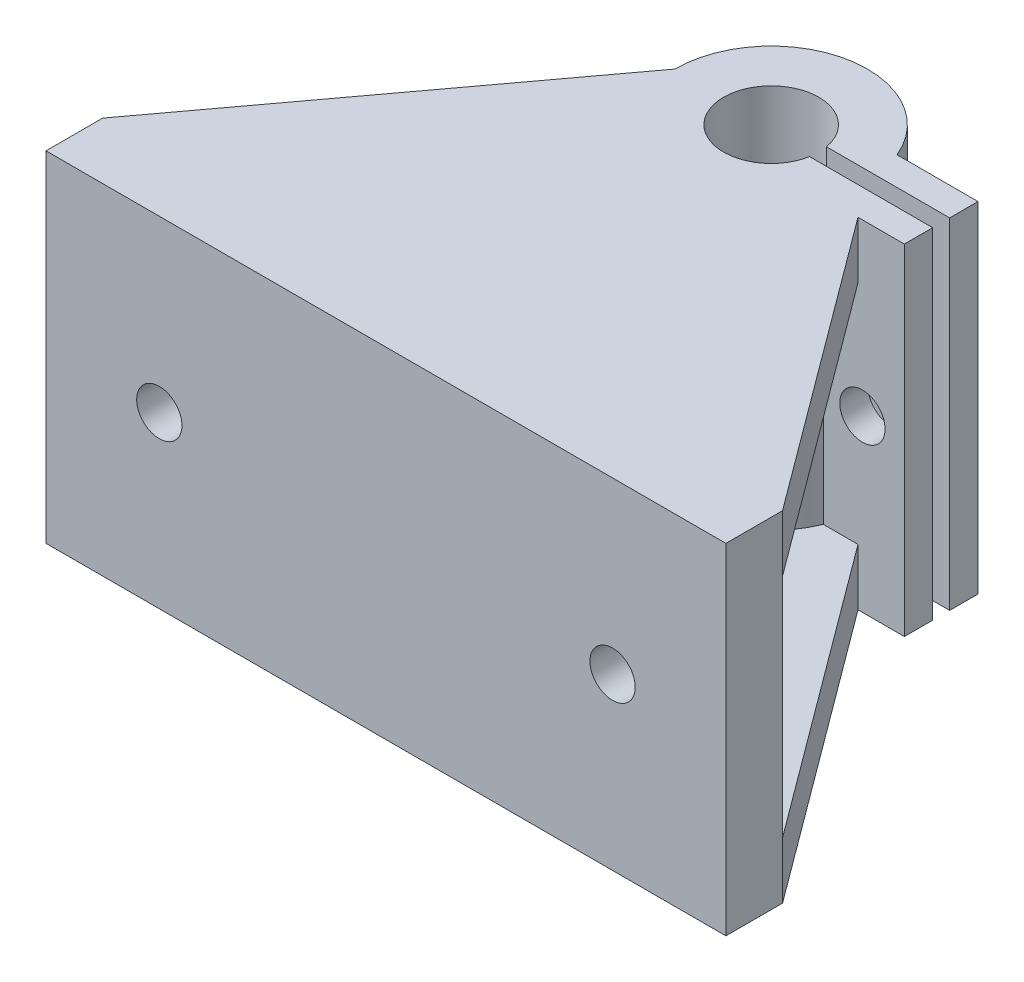
ISO-10303-21;
HEADER;
FILE_DESCRIPTION(('STEP AP214'),'2;1');
FILE_NAME('part.step','',(''),(''),'','','');
FILE_SCHEMA(('AUTOMOTIVE_DESIGN { 1 0 10303 214 1 1 1 1 }'));
ENDSEC;
DATA;
#1=APPLICATION_CONTEXT('core data for automotive mechanical design processes');
#2=APPLICATION_PROTOCOL_DEFINITION('international standard','automotive_design',2000,#1);
#3=PRODUCT_CONTEXT('',#1,'mechanical');
#4=PRODUCT('Part','Part','',(#3));
#5=PRODUCT_RELATED_PRODUCT_CATEGORY('part','',(#4));
#6=PRODUCT_DEFINITION_FORMATION('','',#4);
#7=PRODUCT_DEFINITION_CONTEXT('part definition',#1,'design');
#8=PRODUCT_DEFINITION('design','',#6,#7);
#9=PRODUCT_DEFINITION_SHAPE('','',#8);
#10=(LENGTH_UNIT() NAMED_UNIT(*) SI_UNIT(.MILLI.,.METRE.));
#11=(NAMED_UNIT(*) PLANE_ANGLE_UNIT() SI_UNIT($,.RADIAN.));
#12=(NAMED_UNIT(*) SI_UNIT($,.STERADIAN.) SOLID_ANGLE_UNIT());
#13=UNCERTAINTY_MEASURE_WITH_UNIT(LENGTH_MEASURE(1.E-05),#10,'distance_accuracy_value','');
#14=(GEOMETRIC_REPRESENTATION_CONTEXT(3) GLOBAL_UNCERTAINTY_ASSIGNED_CONTEXT((#13)) GLOBAL_UNIT_ASSIGNED_CONTEXT((#10,
#11,#12)) REPRESENTATION_CONTEXT('',''));
#15=CARTESIAN_POINT('',(0.,0.,0.));
#16=DIRECTION('',(0.,0.,1.));
#17=DIRECTION('',(1.,0.,0.));
#18=AXIS2_PLACEMENT_3D('',#15,#16,#17);
#19=CARTESIAN_POINT('',(0.,30.,-34.));
#20=DIRECTION('',(0.,-1.,0.));
#21=DIRECTION('',(0.,0.,-1.));
#22=AXIS2_PLACEMENT_3D('',#19,#20,#21);
#23=CYLINDRICAL_SURFACE('',#22,8.5);
#24=CARTESIAN_POINT('',(0.,30.,-34.));
#25=DIRECTION('',(0.,1.,0.));
#26=DIRECTION('',(0.,0.,1.));
#27=AXIS2_PLACEMENT_3D('',#24,#25,#26);
#28=CIRCLE('',#27,8.5);
#29=CARTESIAN_POINT('',(7.85413903620251,30.,-37.25));
#30=VERTEX_POINT('',#29);
#31=CARTESIAN_POINT('',(-8.5,30.,-33.9999999999999));
#32=VERTEX_POINT('',#31);
#33=EDGE_CURVE('E304',#30,#32,#28,.T.);
#34=ORIENTED_EDGE('',*,*,#33,.F.);
#35=DIRECTION('',(0.,-1.,0.));
#36=VECTOR('',#35,1.);
#37=CARTESIAN_POINT('',(7.85413903620251,30.,-37.25));
#38=LINE('',#37,#36);
#39=CARTESIAN_POINT('',(7.85413903620251,0.,-37.25));
#40=VERTEX_POINT('',#39);
#41=EDGE_CURVE('E214',#30,#40,#38,.T.);
#42=ORIENTED_EDGE('',*,*,#41,.T.);
#43=CARTESIAN_POINT('',(0.,0.,-34.));
#44=DIRECTION('',(0.,1.,0.));
#45=DIRECTION('',(0.,0.,1.));
#46=AXIS2_PLACEMENT_3D('',#43,#44,#45);
#47=CIRCLE('',#46,8.5);
#48=CARTESIAN_POINT('',(-8.5,0.,-34.));
#49=VERTEX_POINT('',#48);
#50=EDGE_CURVE('E302',#40,#49,#47,.T.);
#51=ORIENTED_EDGE('',*,*,#50,.T.);
#52=DIRECTION('',(0.,-1.,0.));
#53=VECTOR('',#52,1.);
#54=CARTESIAN_POINT('',(-8.5,5.,-34.));
#55=LINE('',#54,#53);
#56=CARTESIAN_POINT('',(-8.5,5.,-34.));
#57=VERTEX_POINT('',#56);
#58=EDGE_CURVE('E326',#57,#49,#55,.T.);
#59=ORIENTED_EDGE('',*,*,#58,.F.);
#60=CARTESIAN_POINT('',(0.,5.,-34.));
#61=DIRECTION('',(0.,1.,0.));
#62=DIRECTION('',(0.,0.,1.));
#63=AXIS2_PLACEMENT_3D('',#60,#61,#62);
#64=CIRCLE('',#63,8.5);
#65=CARTESIAN_POINT('',(-3.,5.,-26.0470131397066));
#66=VERTEX_POINT('',#65);
#67=EDGE_CURVE('E359',#66,#57,#64,.F.);
#68=ORIENTED_EDGE('',*,*,#67,.F.);
#69=DIRECTION('',(0.,-1.,0.));
#70=VECTOR('',#69,1.);
#71=CARTESIAN_POINT('',(-3.,30.,-26.0470131397066));
#72=LINE('',#71,#70);
#73=CARTESIAN_POINT('',(-3.,25.,-26.0470131397066));
#74=VERTEX_POINT('',#73);
#75=EDGE_CURVE('E365',#66,#74,#72,.F.);
#76=ORIENTED_EDGE('',*,*,#75,.T.);
#77=CARTESIAN_POINT('',(0.,25.,-34.));
#78=DIRECTION('',(0.,-1.,0.));
#79=DIRECTION('',(0.,0.,-1.));
#80=AXIS2_PLACEMENT_3D('',#77,#78,#79);
#81=CIRCLE('',#80,8.5);
#82=CARTESIAN_POINT('',(-8.5,25.,-33.9999999999999));
#83=VERTEX_POINT('',#82);
#84=EDGE_CURVE('E285',#74,#83,#81,.T.);
#85=ORIENTED_EDGE('',*,*,#84,.T.);
#86=DIRECTION('',(0.,1.,0.));
#87=VECTOR('',#86,1.);
#88=CARTESIAN_POINT('',(-8.5,25.,-33.9999999999999));
#89=LINE('',#88,#87);
#90=EDGE_CURVE('E275',#83,#32,#89,.T.);
#91=ORIENTED_EDGE('',*,*,#90,.T.);
#92=EDGE_LOOP('',(#34,#42,#51,#59,#68,#76,#85,#91));
#93=FACE_BOUND('',#92,.T.);
#94=ADVANCED_FACE('F36',(#93),#23,.T.);
#95=CARTESIAN_POINT('',(-30.,30.,-5.));
#96=DIRECTION('',(0.,0.,1.));
#97=DIRECTION('',(1.,0.,0.));
#98=AXIS2_PLACEMENT_3D('',#95,#96,#97);
#99=PLANE('',#98);
#100=CARTESIAN_POINT('',(-20.,15.,-5.));
#101=DIRECTION('',(0.,0.,1.));
#102=DIRECTION('',(1.,0.,0.));
#103=AXIS2_PLACEMENT_3D('',#100,#101,#102);
#104=CIRCLE('',#103,2.);
#105=CARTESIAN_POINT('',(-18.,15.,-5.));
#106=VERTEX_POINT('',#105);
#107=EDGE_CURVE('E255',#106,#106,#104,.F.);
#108=ORIENTED_EDGE('',*,*,#107,.F.);
#109=EDGE_LOOP('',(#108));
#110=FACE_BOUND('',#109,.T.);
#111=DIRECTION('',(0.,-1.,0.));
#112=VECTOR('',#111,1.);
#113=CARTESIAN_POINT('',(-30.,30.,-5.));
#114=LINE('',#113,#112);
#115=CARTESIAN_POINT('',(-30.,25.,-5.));
#116=VERTEX_POINT('',#115);
#117=CARTESIAN_POINT('',(-30.,5.,-5.));
#118=VERTEX_POINT('',#117);
#119=EDGE_CURVE('E340',#116,#118,#114,.T.);
#120=ORIENTED_EDGE('',*,*,#119,.F.);
#121=DIRECTION('',(1.,0.,0.));
#122=VECTOR('',#121,1.);
#123=CARTESIAN_POINT('',(30.,25.,-5.));
#124=LINE('',#123,#122);
#125=CARTESIAN_POINT('',(-3.,25.,-5.));
#126=VERTEX_POINT('',#125);
#127=EDGE_CURVE('E269',#116,#126,#124,.T.);
#128=ORIENTED_EDGE('',*,*,#127,.T.);
#129=DIRECTION('',(0.,1.,0.));
#130=VECTOR('',#129,1.);
#131=CARTESIAN_POINT('',(-3.,4.,-5.));
#132=LINE('',#131,#130);
#133=CARTESIAN_POINT('',(-3.,5.,-5.));
#134=VERTEX_POINT('',#133);
#135=EDGE_CURVE('E291',#134,#126,#132,.T.);
#136=ORIENTED_EDGE('',*,*,#135,.F.);
#137=DIRECTION('',(-1.,0.,0.));
#138=VECTOR('',#137,1.);
#139=CARTESIAN_POINT('',(-30.,5.,-5.));
#140=LINE('',#139,#138);
#141=EDGE_CURVE('E312',#134,#118,#140,.T.);
#142=ORIENTED_EDGE('',*,*,#141,.T.);
#143=EDGE_LOOP('',(#120,#128,#136,#142));
#144=FACE_BOUND('',#143,.T.);
#145=ADVANCED_FACE('F452',(#110,#144),#99,.F.);
#146=CARTESIAN_POINT('',(0.,5.,0.));
#147=DIRECTION('',(0.,1.,0.));
#148=DIRECTION('',(0.,0.,1.));
#149=AXIS2_PLACEMENT_3D('',#146,#147,#148);
#150=PLANE('',#149);
#151=DIRECTION('',(0.,0.,1.));
#152=VECTOR('',#151,1.);
#153=CARTESIAN_POINT('',(-3.,5.,0.));
#154=LINE('',#153,#152);
#155=EDGE_CURVE('E296',#66,#134,#154,.T.);
#156=ORIENTED_EDGE('',*,*,#155,.F.);
#157=ORIENTED_EDGE('',*,*,#67,.T.);
#158=DIRECTION('',(0.595558727232643,0.,-0.803311771616123));
#159=VECTOR('',#158,1.);
#160=CARTESIAN_POINT('',(-8.5,5.,-34.));
#161=LINE('',#160,#159);
#162=EDGE_CURVE('E311',#118,#57,#161,.T.);
#163=ORIENTED_EDGE('',*,*,#162,.F.);
#164=ORIENTED_EDGE('',*,*,#141,.F.);
#165=EDGE_LOOP('',(#156,#157,#163,#164));
#166=FACE_BOUND('',#165,.T.);
#167=ADVANCED_FACE('F457',(#166),#150,.T.);
#168=CARTESIAN_POINT('',(-30.,30.,0.));
#169=DIRECTION('',(1.,0.,0.));
#170=DIRECTION('',(0.,0.,-1.));
#171=AXIS2_PLACEMENT_3D('',#168,#169,#170);
#172=PLANE('',#171);
#173=DIRECTION('',(0.,0.,1.));
#174=VECTOR('',#173,1.);
#175=CARTESIAN_POINT('',(-30.,0.,0.));
#176=LINE('',#175,#174);
#177=CARTESIAN_POINT('',(-30.,0.,-5.));
#178=VERTEX_POINT('',#177);
#179=CARTESIAN_POINT('',(-30.,0.,0.));
#180=VERTEX_POINT('',#179);
#181=EDGE_CURVE('E325',#178,#180,#176,.T.);
#182=ORIENTED_EDGE('',*,*,#181,.T.);
#183=DIRECTION('',(0.,-1.,0.));
#184=VECTOR('',#183,1.);
#185=CARTESIAN_POINT('',(-30.,30.,0.));
#186=LINE('',#185,#184);
#187=CARTESIAN_POINT('',(-30.,30.,0.));
#188=VERTEX_POINT('',#187);
#189=EDGE_CURVE('E356',#188,#180,#186,.T.);
#190=ORIENTED_EDGE('',*,*,#189,.F.);
#191=DIRECTION('',(0.,0.,1.));
#192=VECTOR('',#191,1.);
#193=CARTESIAN_POINT('',(-30.,30.,0.));
#194=LINE('',#193,#192);
#195=CARTESIAN_POINT('',(-30.,30.,-5.));
#196=VERTEX_POINT('',#195);
#197=EDGE_CURVE('E331',#196,#188,#194,.T.);
#198=ORIENTED_EDGE('',*,*,#197,.F.);
#199=EDGE_CURVE('E347',#196,#116,#114,.T.);
#200=ORIENTED_EDGE('',*,*,#199,.T.);
#201=ORIENTED_EDGE('',*,*,#119,.T.);
#202=DIRECTION('',(0.,-1.,0.));
#203=VECTOR('',#202,1.);
#204=CARTESIAN_POINT('',(-30.,5.,-5.));
#205=LINE('',#204,#203);
#206=EDGE_CURVE('E317',#118,#178,#205,.T.);
#207=ORIENTED_EDGE('',*,*,#206,.T.);
#208=EDGE_LOOP('',(#182,#190,#198,#200,#201,#207));
#209=FACE_BOUND('',#208,.T.);
#210=ADVANCED_FACE('F38',(#209),#172,.F.);
#211=CARTESIAN_POINT('',(-30.,30.,0.));
#212=DIRECTION('',(0.,0.,-1.));
#213=DIRECTION('',(-1.,0.,0.));
#214=AXIS2_PLACEMENT_3D('',#211,#212,#213);
#215=PLANE('',#214);
#216=CARTESIAN_POINT('',(-20.,15.,0.));
#217=DIRECTION('',(0.,0.,1.));
#218=DIRECTION('',(1.,0.,0.));
#219=AXIS2_PLACEMENT_3D('',#216,#217,#218);
#220=CIRCLE('',#219,2.);
#221=CARTESIAN_POINT('',(-18.,15.,0.));
#222=VERTEX_POINT('',#221);
#223=EDGE_CURVE('E252',#222,#222,#220,.T.);
#224=ORIENTED_EDGE('',*,*,#223,.F.);
#225=EDGE_LOOP('',(#224));
#226=FACE_BOUND('',#225,.T.);
#227=CARTESIAN_POINT('',(20.,15.,0.));
#228=DIRECTION('',(0.,0.,1.));
#229=DIRECTION('',(1.,0.,0.));
#230=AXIS2_PLACEMENT_3D('',#227,#228,#229);
#231=CIRCLE('',#230,2.);
#232=CARTESIAN_POINT('',(22.,15.,0.));
#233=VERTEX_POINT('',#232);
#234=EDGE_CURVE('E251',#233,#233,#231,.T.);
#235=ORIENTED_EDGE('',*,*,#234,.F.);
#236=EDGE_LOOP('',(#235));
#237=FACE_BOUND('',#236,.T.);
#238=DIRECTION('',(1.,0.,0.));
#239=VECTOR('',#238,1.);
#240=CARTESIAN_POINT('',(-30.,0.,0.));
#241=LINE('',#240,#239);
#242=CARTESIAN_POINT('',(30.,0.,0.));
#243=VERTEX_POINT('',#242);
#244=EDGE_CURVE('E343',#180,#243,#241,.T.);
#245=ORIENTED_EDGE('',*,*,#244,.T.);
#246=DIRECTION('',(0.,-1.,0.));
#247=VECTOR('',#246,1.);
#248=CARTESIAN_POINT('',(30.,30.,0.));
#249=LINE('',#248,#247);
#250=CARTESIAN_POINT('',(30.,30.,0.));
#251=VERTEX_POINT('',#250);
#252=EDGE_CURVE('E353',#251,#243,#249,.T.);
#253=ORIENTED_EDGE('',*,*,#252,.F.);
#254=DIRECTION('',(1.,0.,0.));
#255=VECTOR('',#254,1.);
#256=CARTESIAN_POINT('',(-30.,30.,0.));
#257=LINE('',#256,#255);
#258=EDGE_CURVE('E334',#188,#251,#257,.T.);
#259=ORIENTED_EDGE('',*,*,#258,.F.);
#260=ORIENTED_EDGE('',*,*,#189,.T.);
#261=EDGE_LOOP('',(#245,#253,#259,#260));
#262=FACE_BOUND('',#261,.T.);
#263=ADVANCED_FACE('F421',(#226,#237,#262),#215,.F.);
#264=CARTESIAN_POINT('',(30.,30.,0.));
#265=DIRECTION('',(-1.,0.,0.));
#266=DIRECTION('',(0.,0.,1.));
#267=AXIS2_PLACEMENT_3D('',#264,#265,#266);
#268=PLANE('',#267);
#269=DIRECTION('',(0.,0.,-1.));
#270=VECTOR('',#269,1.);
#271=CARTESIAN_POINT('',(30.,0.,0.));
#272=LINE('',#271,#270);
#273=CARTESIAN_POINT('',(30.,0.,-5.));
#274=VERTEX_POINT('',#273);
#275=EDGE_CURVE('E335',#243,#274,#272,.T.);
#276=ORIENTED_EDGE('',*,*,#275,.T.);
#277=DIRECTION('',(0.,-1.,0.));
#278=VECTOR('',#277,1.);
#279=CARTESIAN_POINT('',(30.,5.,-5.));
#280=LINE('',#279,#278);
#281=CARTESIAN_POINT('',(30.,5.,-5.));
#282=VERTEX_POINT('',#281);
#283=EDGE_CURVE('E322',#282,#274,#280,.T.);
#284=ORIENTED_EDGE('',*,*,#283,.F.);
#285=DIRECTION('',(0.,-1.,0.));
#286=VECTOR('',#285,1.);
#287=CARTESIAN_POINT('',(30.,30.,-5.));
#288=LINE('',#287,#286);
#289=CARTESIAN_POINT('',(30.,25.,-5.));
#290=VERTEX_POINT('',#289);
#291=EDGE_CURVE('E350',#290,#282,#288,.T.);
#292=ORIENTED_EDGE('',*,*,#291,.F.);
#293=CARTESIAN_POINT('',(30.,30.,-5.));
#294=VERTEX_POINT('',#293);
#295=EDGE_CURVE('E351',#294,#290,#288,.T.);
#296=ORIENTED_EDGE('',*,*,#295,.F.);
#297=DIRECTION('',(0.,0.,-1.));
#298=VECTOR('',#297,1.);
#299=CARTESIAN_POINT('',(30.,30.,0.));
#300=LINE('',#299,#298);
#301=EDGE_CURVE('E337',#251,#294,#300,.T.);
#302=ORIENTED_EDGE('',*,*,#301,.F.);
#303=ORIENTED_EDGE('',*,*,#252,.T.);
#304=EDGE_LOOP('',(#276,#284,#292,#296,#302,#303));
#305=FACE_BOUND('',#304,.T.);
#306=ADVANCED_FACE('F400',(#305),#268,.F.);
#307=CARTESIAN_POINT('',(20.,15.,-5.));
#308=DIRECTION('',(0.,0.,1.));
#309=DIRECTION('',(1.,0.,0.));
#310=AXIS2_PLACEMENT_3D('',#307,#308,#309);
#311=CIRCLE('',#310,2.);
#312=CARTESIAN_POINT('',(22.,15.,-5.));
#313=VERTEX_POINT('',#312);
#314=EDGE_CURVE('E256',#313,#313,#311,.F.);
#315=ORIENTED_EDGE('',*,*,#314,.F.);
#316=EDGE_LOOP('',(#315));
#317=FACE_BOUND('',#316,.T.);
#318=DIRECTION('',(0.,1.,0.));
#319=VECTOR('',#318,1.);
#320=CARTESIAN_POINT('',(3.,4.,-5.));
#321=LINE('',#320,#319);
#322=CARTESIAN_POINT('',(3.,5.,-5.));
#323=VERTEX_POINT('',#322);
#324=CARTESIAN_POINT('',(3.,25.,-5.));
#325=VERTEX_POINT('',#324);
#326=EDGE_CURVE('E287',#323,#325,#321,.T.);
#327=ORIENTED_EDGE('',*,*,#326,.T.);
#328=EDGE_CURVE('E267',#325,#290,#124,.T.);
#329=ORIENTED_EDGE('',*,*,#328,.T.);
#330=ORIENTED_EDGE('',*,*,#291,.T.);
#331=EDGE_CURVE('E308',#282,#323,#140,.T.);
#332=ORIENTED_EDGE('',*,*,#331,.T.);
#333=EDGE_LOOP('',(#327,#329,#330,#332));
#334=FACE_BOUND('',#333,.T.);
#335=ADVANCED_FACE('F397',(#317,#334),#99,.F.);
#336=CARTESIAN_POINT('',(0.,30.,0.));
#337=DIRECTION('',(0.,-1.,0.));
#338=DIRECTION('',(0.,0.,-1.));
#339=AXIS2_PLACEMENT_3D('',#336,#337,#338);
#340=PLANE('',#339);
#341=CARTESIAN_POINT('',(0.,30.,-34.));
#342=DIRECTION('',(0.,1.,0.));
#343=DIRECTION('',(0.,0.,1.));
#344=AXIS2_PLACEMENT_3D('',#341,#342,#343);
#345=CIRCLE('',#344,4.2);
#346=CARTESIAN_POINT('',(4.13249319418678,30.,-34.75));
#347=VERTEX_POINT('',#346);
#348=CARTESIAN_POINT('',(4.13249319418678,30.,-33.25));
#349=VERTEX_POINT('',#348);
#350=EDGE_CURVE('E299',#347,#349,#345,.T.);
#351=ORIENTED_EDGE('',*,*,#350,.F.);
#352=DIRECTION('',(-1.,0.,0.));
#353=VECTOR('',#352,1.);
#354=CARTESIAN_POINT('',(0.,30.,-34.75));
#355=LINE('',#354,#353);
#356=CARTESIAN_POINT('',(15.,30.,-34.75));
#357=VERTEX_POINT('',#356);
#358=EDGE_CURVE('E59',#357,#347,#355,.T.);
#359=ORIENTED_EDGE('',*,*,#358,.F.);
#360=DIRECTION('',(0.,0.,-1.));
#361=VECTOR('',#360,1.);
#362=CARTESIAN_POINT('',(15.,30.,-34.75));
#363=LINE('',#362,#361);
#364=CARTESIAN_POINT('',(15.,30.,-37.25));
#365=VERTEX_POINT('',#364);
#366=EDGE_CURVE('E200',#357,#365,#363,.T.);
#367=ORIENTED_EDGE('',*,*,#366,.T.);
#368=DIRECTION('',(-1.,0.,0.));
#369=VECTOR('',#368,1.);
#370=CARTESIAN_POINT('',(5.75038275019334,30.,-37.25));
#371=LINE('',#370,#369);
#372=EDGE_CURVE('E51',#365,#30,#371,.T.);
#373=ORIENTED_EDGE('',*,*,#372,.T.);
#374=ORIENTED_EDGE('',*,*,#33,.T.);
#375=DIRECTION('',(-0.595558727232644,0.,0.803311771616122));
#376=VECTOR('',#375,1.);
#377=CARTESIAN_POINT('',(-8.5,30.,-33.9999999999999));
#378=LINE('',#377,#376);
#379=EDGE_CURVE('E259',#32,#196,#378,.T.);
#380=ORIENTED_EDGE('',*,*,#379,.T.);
#381=ORIENTED_EDGE('',*,*,#197,.T.);
#382=ORIENTED_EDGE('',*,*,#258,.T.);
#383=ORIENTED_EDGE('',*,*,#301,.T.);
#384=DIRECTION('',(-0.595558727232643,0.,-0.803311771616123));
#385=VECTOR('',#384,1.);
#386=CARTESIAN_POINT('',(8.5,30.,-34.));
#387=LINE('',#386,#385);
#388=CARTESIAN_POINT('',(10.9094827586207,30.,-30.75));
#389=VERTEX_POINT('',#388);
#390=EDGE_CURVE('E268',#294,#389,#387,.T.);
#391=ORIENTED_EDGE('',*,*,#390,.T.);
#392=DIRECTION('',(1.,0.,0.));
#393=VECTOR('',#392,1.);
#394=CARTESIAN_POINT('',(5.75038275019334,30.,-30.75));
#395=LINE('',#394,#393);
#396=CARTESIAN_POINT('',(15.,30.,-30.75));
#397=VERTEX_POINT('',#396);
#398=EDGE_CURVE('E218',#389,#397,#395,.T.);
#399=ORIENTED_EDGE('',*,*,#398,.T.);
#400=DIRECTION('',(0.,0.,-1.));
#401=VECTOR('',#400,1.);
#402=CARTESIAN_POINT('',(15.,30.,-33.25));
#403=LINE('',#402,#401);
#404=CARTESIAN_POINT('',(15.,30.,-33.25));
#405=VERTEX_POINT('',#404);
#406=EDGE_CURVE('E222',#397,#405,#403,.T.);
#407=ORIENTED_EDGE('',*,*,#406,.T.);
#408=DIRECTION('',(1.,0.,0.));
#409=VECTOR('',#408,1.);
#410=CARTESIAN_POINT('',(0.,30.,-33.25));
#411=LINE('',#410,#409);
#412=EDGE_CURVE('E193',#349,#405,#411,.T.);
#413=ORIENTED_EDGE('',*,*,#412,.F.);
#414=EDGE_LOOP('',(#351,#359,#367,#373,#374,#380,#381,#382,#383,#391,#399,#407,#413));
#415=FACE_BOUND('',#414,.T.);
#416=ADVANCED_FACE('F414',(#415),#340,.F.);
#417=CARTESIAN_POINT('',(0.,0.,0.));
#418=DIRECTION('',(0.,-1.,0.));
#419=DIRECTION('',(0.,0.,-1.));
#420=AXIS2_PLACEMENT_3D('',#417,#418,#419);
#421=PLANE('',#420);
#422=DIRECTION('',(-1.,0.,0.));
#423=VECTOR('',#422,1.);
#424=CARTESIAN_POINT('',(0.,0.,-34.75));
#425=LINE('',#424,#423);
#426=CARTESIAN_POINT('',(15.,0.,-34.75));
#427=VERTEX_POINT('',#426);
#428=CARTESIAN_POINT('',(4.13249319418678,0.,-34.75));
#429=VERTEX_POINT('',#428);
#430=EDGE_CURVE('E183',#427,#429,#425,.T.);
#431=ORIENTED_EDGE('',*,*,#430,.T.);
#432=CARTESIAN_POINT('',(0.,0.,-34.));
#433=DIRECTION('',(0.,1.,0.));
#434=DIRECTION('',(0.,0.,1.));
#435=AXIS2_PLACEMENT_3D('',#432,#433,#434);
#436=CIRCLE('',#435,4.2);
#437=CARTESIAN_POINT('',(4.13249319418678,0.,-33.25));
#438=VERTEX_POINT('',#437);
#439=EDGE_CURVE('E298',#429,#438,#436,.T.);
#440=ORIENTED_EDGE('',*,*,#439,.T.);
#441=DIRECTION('',(1.,0.,0.));
#442=VECTOR('',#441,1.);
#443=CARTESIAN_POINT('',(0.,0.,-33.25));
#444=LINE('',#443,#442);
#445=CARTESIAN_POINT('',(15.,0.,-33.25));
#446=VERTEX_POINT('',#445);
#447=EDGE_CURVE('E249',#438,#446,#444,.T.);
#448=ORIENTED_EDGE('',*,*,#447,.T.);
#449=DIRECTION('',(0.,0.,-1.));
#450=VECTOR('',#449,1.);
#451=CARTESIAN_POINT('',(15.,0.,-33.25));
#452=LINE('',#451,#450);
#453=CARTESIAN_POINT('',(15.,0.,-30.75));
#454=VERTEX_POINT('',#453);
#455=EDGE_CURVE('E221',#454,#446,#452,.T.);
#456=ORIENTED_EDGE('',*,*,#455,.F.);
#457=DIRECTION('',(1.,0.,0.));
#458=VECTOR('',#457,1.);
#459=CARTESIAN_POINT('',(5.75038275019334,0.,-30.75));
#460=LINE('',#459,#458);
#461=CARTESIAN_POINT('',(10.9094827586207,0.,-30.75));
#462=VERTEX_POINT('',#461);
#463=EDGE_CURVE('E219',#462,#454,#460,.T.);
#464=ORIENTED_EDGE('',*,*,#463,.F.);
#465=DIRECTION('',(0.595558727232643,0.,0.803311771616123));
#466=VECTOR('',#465,1.);
#467=CARTESIAN_POINT('',(30.,0.,-5.));
#468=LINE('',#467,#466);
#469=EDGE_CURVE('E320',#462,#274,#468,.T.);
#470=ORIENTED_EDGE('',*,*,#469,.T.);
#471=ORIENTED_EDGE('',*,*,#275,.F.);
#472=ORIENTED_EDGE('',*,*,#244,.F.);
#473=ORIENTED_EDGE('',*,*,#181,.F.);
#474=DIRECTION('',(0.595558727232643,0.,-0.803311771616123));
#475=VECTOR('',#474,1.);
#476=CARTESIAN_POINT('',(-8.5,0.,-34.));
#477=LINE('',#476,#475);
#478=EDGE_CURVE('E306',#178,#49,#477,.T.);
#479=ORIENTED_EDGE('',*,*,#478,.T.);
#480=ORIENTED_EDGE('',*,*,#50,.F.);
#481=DIRECTION('',(-1.,0.,0.));
#482=VECTOR('',#481,1.);
#483=CARTESIAN_POINT('',(5.75038275019334,0.,-37.25));
#484=LINE('',#483,#482);
#485=CARTESIAN_POINT('',(15.,0.,-37.25));
#486=VERTEX_POINT('',#485);
#487=EDGE_CURVE('E202',#486,#40,#484,.T.);
#488=ORIENTED_EDGE('',*,*,#487,.F.);
#489=DIRECTION('',(0.,0.,-1.));
#490=VECTOR('',#489,1.);
#491=CARTESIAN_POINT('',(15.,0.,-34.75));
#492=LINE('',#491,#490);
#493=EDGE_CURVE('E198',#427,#486,#492,.T.);
#494=ORIENTED_EDGE('',*,*,#493,.F.);
#495=EDGE_LOOP('',(#431,#440,#448,#456,#464,#470,#471,#472,#473,#479,#480,#488,#494));
#496=FACE_BOUND('',#495,.T.);
#497=ADVANCED_FACE('F204',(#496),#421,.T.);
#498=CARTESIAN_POINT('',(30.,5.,-5.));
#499=DIRECTION('',(0.803311771616123,0.,-0.595558727232643));
#500=DIRECTION('',(-0.595558727232643,0.,-0.803311771616123));
#501=AXIS2_PLACEMENT_3D('',#498,#499,#500);
#502=PLANE('',#501);
#503=DIRECTION('',(0.,-1.,0.));
#504=VECTOR('',#503,1.);
#505=CARTESIAN_POINT('',(10.9094827586207,5.,-30.75));
#506=LINE('',#505,#504);
#507=CARTESIAN_POINT('',(10.9094827586207,5.,-30.75));
#508=VERTEX_POINT('',#507);
#509=EDGE_CURVE('E241',#508,#462,#506,.T.);
#510=ORIENTED_EDGE('',*,*,#509,.F.);
#511=DIRECTION('',(0.595558727232643,0.,0.803311771616123));
#512=VECTOR('',#511,1.);
#513=CARTESIAN_POINT('',(30.,5.,-5.));
#514=LINE('',#513,#512);
#515=EDGE_CURVE('E315',#508,#282,#514,.T.);
#516=ORIENTED_EDGE('',*,*,#515,.T.);
#517=ORIENTED_EDGE('',*,*,#283,.T.);
#518=ORIENTED_EDGE('',*,*,#469,.F.);
#519=EDGE_LOOP('',(#510,#516,#517,#518));
#520=FACE_BOUND('',#519,.T.);
#521=ADVANCED_FACE('F393',(#520),#502,.T.);
#522=CARTESIAN_POINT('',(-8.5,5.,-34.));
#523=DIRECTION('',(-0.803311771616123,0.,-0.595558727232643));
#524=DIRECTION('',(-0.595558727232643,0.,0.803311771616123));
#525=AXIS2_PLACEMENT_3D('',#522,#523,#524);
#526=PLANE('',#525);
#527=ORIENTED_EDGE('',*,*,#478,.F.);
#528=ORIENTED_EDGE('',*,*,#206,.F.);
#529=ORIENTED_EDGE('',*,*,#162,.T.);
#530=ORIENTED_EDGE('',*,*,#58,.T.);
#531=EDGE_LOOP('',(#527,#528,#529,#530));
#532=FACE_BOUND('',#531,.T.);
#533=ADVANCED_FACE('F425',(#532),#526,.T.);
#534=DIRECTION('',(1.,0.,0.));
#535=VECTOR('',#534,1.);
#536=CARTESIAN_POINT('',(0.,5.,-30.75));
#537=LINE('',#536,#535);
#538=CARTESIAN_POINT('',(7.8541390362025,5.,-30.75));
#539=VERTEX_POINT('',#538);
#540=EDGE_CURVE('E239',#539,#508,#537,.T.);
#541=ORIENTED_EDGE('',*,*,#540,.F.);
#542=CARTESIAN_POINT('',(3.,5.,-26.0470131397066));
#543=VERTEX_POINT('',#542);
#544=EDGE_CURVE('E360',#539,#543,#64,.F.);
#545=ORIENTED_EDGE('',*,*,#544,.T.);
#546=DIRECTION('',(0.,0.,-1.));
#547=VECTOR('',#546,1.);
#548=CARTESIAN_POINT('',(3.,5.,0.));
#549=LINE('',#548,#547);
#550=EDGE_CURVE('E290',#323,#543,#549,.T.);
#551=ORIENTED_EDGE('',*,*,#550,.F.);
#552=ORIENTED_EDGE('',*,*,#331,.F.);
#553=ORIENTED_EDGE('',*,*,#515,.F.);
#554=EDGE_LOOP('',(#541,#545,#551,#552,#553));
#555=FACE_BOUND('',#554,.T.);
#556=ADVANCED_FACE('F388',(#555),#150,.T.);
#557=ORIENTED_EDGE('',*,*,#544,.F.);
#558=DIRECTION('',(0.,-1.,0.));
#559=VECTOR('',#558,1.);
#560=CARTESIAN_POINT('',(7.8541390362025,30.,-30.75));
#561=LINE('',#560,#559);
#562=CARTESIAN_POINT('',(7.8541390362025,25.,-30.75));
#563=VERTEX_POINT('',#562);
#564=EDGE_CURVE('E236',#539,#563,#561,.F.);
#565=ORIENTED_EDGE('',*,*,#564,.T.);
#566=CARTESIAN_POINT('',(3.,25.,-26.0470131397066));
#567=VERTEX_POINT('',#566);
#568=EDGE_CURVE('E282',#563,#567,#81,.T.);
#569=ORIENTED_EDGE('',*,*,#568,.T.);
#570=DIRECTION('',(0.,-1.,0.));
#571=VECTOR('',#570,1.);
#572=CARTESIAN_POINT('',(3.,30.,-26.0470131397066));
#573=LINE('',#572,#571);
#574=EDGE_CURVE('E362',#567,#543,#573,.T.);
#575=ORIENTED_EDGE('',*,*,#574,.T.);
#576=EDGE_LOOP('',(#557,#565,#569,#575));
#577=FACE_BOUND('',#576,.T.);
#578=ADVANCED_FACE('F381',(#577),#23,.T.);
#579=CARTESIAN_POINT('',(0.,30.,-34.));
#580=DIRECTION('',(0.,-1.,0.));
#581=DIRECTION('',(0.,0.,-1.));
#582=AXIS2_PLACEMENT_3D('',#579,#580,#581);
#583=CYLINDRICAL_SURFACE('',#582,4.2);
#584=DIRECTION('',(0.,-1.,0.));
#585=VECTOR('',#584,1.);
#586=CARTESIAN_POINT('',(4.13249319418678,30.,-34.75));
#587=LINE('',#586,#585);
#588=EDGE_CURVE('E188',#429,#347,#587,.F.);
#589=ORIENTED_EDGE('',*,*,#588,.T.);
#590=ORIENTED_EDGE('',*,*,#350,.T.);
#591=DIRECTION('',(0.,-1.,0.));
#592=VECTOR('',#591,1.);
#593=CARTESIAN_POINT('',(4.13249319418678,30.,-33.25));
#594=LINE('',#593,#592);
#595=EDGE_CURVE('E243',#349,#438,#594,.T.);
#596=ORIENTED_EDGE('',*,*,#595,.T.);
#597=ORIENTED_EDGE('',*,*,#439,.F.);
#598=EDGE_LOOP('',(#589,#590,#596,#597));
#599=FACE_BOUND('',#598,.T.);
#600=ADVANCED_FACE('F434',(#599),#583,.F.);
#601=CARTESIAN_POINT('',(-3.,4.,-5.));
#602=DIRECTION('',(-1.,0.,0.));
#603=DIRECTION('',(0.,0.,1.));
#604=AXIS2_PLACEMENT_3D('',#601,#602,#603);
#605=PLANE('',#604);
#606=DIRECTION('',(0.,0.,1.));
#607=VECTOR('',#606,1.);
#608=CARTESIAN_POINT('',(-3.,25.,-5.));
#609=LINE('',#608,#607);
#610=EDGE_CURVE('E284',#74,#126,#609,.T.);
#611=ORIENTED_EDGE('',*,*,#610,.F.);
#612=ORIENTED_EDGE('',*,*,#75,.F.);
#613=ORIENTED_EDGE('',*,*,#155,.T.);
#614=ORIENTED_EDGE('',*,*,#135,.T.);
#615=EDGE_LOOP('',(#611,#612,#613,#614));
#616=FACE_BOUND('',#615,.T.);
#617=ADVANCED_FACE('F467',(#616),#605,.T.);
#618=CARTESIAN_POINT('',(3.,4.,-5.));
#619=DIRECTION('',(1.,0.,0.));
#620=DIRECTION('',(0.,0.,-1.));
#621=AXIS2_PLACEMENT_3D('',#618,#619,#620);
#622=PLANE('',#621);
#623=DIRECTION('',(0.,0.,-1.));
#624=VECTOR('',#623,1.);
#625=CARTESIAN_POINT('',(3.,25.,-5.));
#626=LINE('',#625,#624);
#627=EDGE_CURVE('E44',#325,#567,#626,.T.);
#628=ORIENTED_EDGE('',*,*,#627,.F.);
#629=ORIENTED_EDGE('',*,*,#326,.F.);
#630=ORIENTED_EDGE('',*,*,#550,.T.);
#631=ORIENTED_EDGE('',*,*,#574,.F.);
#632=EDGE_LOOP('',(#628,#629,#630,#631));
#633=FACE_BOUND('',#632,.T.);
#634=ADVANCED_FACE('F377',(#633),#622,.T.);
#635=CARTESIAN_POINT('',(0.,25.,0.));
#636=DIRECTION('',(0.,-1.,0.));
#637=DIRECTION('',(0.,0.,-1.));
#638=AXIS2_PLACEMENT_3D('',#635,#636,#637);
#639=PLANE('',#638);
#640=DIRECTION('',(-1.,0.,0.));
#641=VECTOR('',#640,1.);
#642=CARTESIAN_POINT('',(0.,25.,-30.75));
#643=LINE('',#642,#641);
#644=CARTESIAN_POINT('',(10.9094827586207,25.,-30.75));
#645=VERTEX_POINT('',#644);
#646=EDGE_CURVE('E232',#645,#563,#643,.T.);
#647=ORIENTED_EDGE('',*,*,#646,.F.);
#648=DIRECTION('',(-0.595558727232643,0.,-0.803311771616123));
#649=VECTOR('',#648,1.);
#650=CARTESIAN_POINT('',(8.5,25.,-34.));
#651=LINE('',#650,#649);
#652=EDGE_CURVE('E272',#290,#645,#651,.T.);
#653=ORIENTED_EDGE('',*,*,#652,.F.);
#654=ORIENTED_EDGE('',*,*,#328,.F.);
#655=ORIENTED_EDGE('',*,*,#627,.T.);
#656=ORIENTED_EDGE('',*,*,#568,.F.);
#657=EDGE_LOOP('',(#647,#653,#654,#655,#656));
#658=FACE_BOUND('',#657,.T.);
#659=ADVANCED_FACE('F373',(#658),#639,.T.);
#660=CARTESIAN_POINT('',(8.5,25.,-34.));
#661=DIRECTION('',(0.803311771616123,0.,-0.595558727232643));
#662=DIRECTION('',(-0.595558727232643,0.,-0.803311771616123));
#663=AXIS2_PLACEMENT_3D('',#660,#661,#662);
#664=PLANE('',#663);
#665=DIRECTION('',(0.,-1.,0.));
#666=VECTOR('',#665,1.);
#667=CARTESIAN_POINT('',(10.9094827586207,25.,-30.75));
#668=LINE('',#667,#666);
#669=EDGE_CURVE('E11',#389,#645,#668,.T.);
#670=ORIENTED_EDGE('',*,*,#669,.F.);
#671=ORIENTED_EDGE('',*,*,#390,.F.);
#672=ORIENTED_EDGE('',*,*,#295,.T.);
#673=ORIENTED_EDGE('',*,*,#652,.T.);
#674=EDGE_LOOP('',(#670,#671,#672,#673));
#675=FACE_BOUND('',#674,.T.);
#676=ADVANCED_FACE('F417',(#675),#664,.T.);
#677=ORIENTED_EDGE('',*,*,#84,.F.);
#678=ORIENTED_EDGE('',*,*,#610,.T.);
#679=ORIENTED_EDGE('',*,*,#127,.F.);
#680=DIRECTION('',(-0.595558727232644,0.,0.803311771616122));
#681=VECTOR('',#680,1.);
#682=CARTESIAN_POINT('',(-8.5,25.,-33.9999999999999));
#683=LINE('',#682,#681);
#684=EDGE_CURVE('E264',#83,#116,#683,.T.);
#685=ORIENTED_EDGE('',*,*,#684,.F.);
#686=EDGE_LOOP('',(#677,#678,#679,#685));
#687=FACE_BOUND('',#686,.T.);
#688=ADVANCED_FACE('F488',(#687),#639,.T.);
#689=CARTESIAN_POINT('',(-8.5,25.,-33.9999999999999));
#690=DIRECTION('',(-0.803311771616123,0.,-0.595558727232644));
#691=DIRECTION('',(-0.595558727232644,0.,0.803311771616123));
#692=AXIS2_PLACEMENT_3D('',#689,#690,#691);
#693=PLANE('',#692);
#694=ORIENTED_EDGE('',*,*,#379,.F.);
#695=ORIENTED_EDGE('',*,*,#90,.F.);
#696=ORIENTED_EDGE('',*,*,#684,.T.);
#697=ORIENTED_EDGE('',*,*,#199,.F.);
#698=EDGE_LOOP('',(#694,#695,#696,#697));
#699=FACE_BOUND('',#698,.T.);
#700=ADVANCED_FACE('F492',(#699),#693,.T.);
#701=CARTESIAN_POINT('',(20.,15.,-42.501));
#702=DIRECTION('',(0.,0.,1.));
#703=DIRECTION('',(1.,0.,0.));
#704=AXIS2_PLACEMENT_3D('',#701,#702,#703);
#705=CYLINDRICAL_SURFACE('',#704,2.);
#706=ORIENTED_EDGE('',*,*,#234,.T.);
#707=EDGE_LOOP('',(#706));
#708=FACE_BOUND('',#707,.T.);
#709=ORIENTED_EDGE('',*,*,#314,.T.);
#710=EDGE_LOOP('',(#709));
#711=FACE_BOUND('',#710,.T.);
#712=ADVANCED_FACE('F447',(#708,#711),#705,.F.);
#713=CARTESIAN_POINT('',(-20.,15.,-42.501));
#714=DIRECTION('',(0.,0.,1.));
#715=DIRECTION('',(1.,0.,0.));
#716=AXIS2_PLACEMENT_3D('',#713,#714,#715);
#717=CYLINDRICAL_SURFACE('',#716,2.);
#718=ORIENTED_EDGE('',*,*,#223,.T.);
#719=EDGE_LOOP('',(#718));
#720=FACE_BOUND('',#719,.T.);
#721=ORIENTED_EDGE('',*,*,#107,.T.);
#722=EDGE_LOOP('',(#721));
#723=FACE_BOUND('',#722,.T.);
#724=ADVANCED_FACE('F438',(#720,#723),#717,.F.);
#725=CARTESIAN_POINT('',(0.,-0.001000000000001,-33.25));
#726=DIRECTION('',(0.,0.,1.));
#727=DIRECTION('',(1.,0.,0.));
#728=AXIS2_PLACEMENT_3D('',#725,#726,#727);
#729=PLANE('',#728);
#730=CARTESIAN_POINT('',(11.3,15.,-33.25));
#731=DIRECTION('',(0.,0.,1.));
#732=DIRECTION('',(1.,0.,0.));
#733=AXIS2_PLACEMENT_3D('',#730,#731,#732);
#734=CIRCLE('',#733,2.);
#735=CARTESIAN_POINT('',(13.3,15.,-33.25));
#736=VERTEX_POINT('',#735);
#737=EDGE_CURVE('E210',#736,#736,#734,.T.);
#738=ORIENTED_EDGE('',*,*,#737,.T.);
#739=EDGE_LOOP('',(#738));
#740=FACE_BOUND('',#739,.T.);
#741=DIRECTION('',(0.,1.,0.));
#742=VECTOR('',#741,1.);
#743=CARTESIAN_POINT('',(15.,0.,-33.25));
#744=LINE('',#743,#742);
#745=EDGE_CURVE('E229',#446,#405,#744,.T.);
#746=ORIENTED_EDGE('',*,*,#745,.F.);
#747=ORIENTED_EDGE('',*,*,#447,.F.);
#748=ORIENTED_EDGE('',*,*,#595,.F.);
#749=ORIENTED_EDGE('',*,*,#412,.T.);
#750=EDGE_LOOP('',(#746,#747,#748,#749));
#751=FACE_BOUND('',#750,.T.);
#752=ADVANCED_FACE('F436',(#740,#751),#729,.F.);
#753=CARTESIAN_POINT('',(0.,-0.001000000000001,-34.75));
#754=DIRECTION('',(0.,0.,-1.));
#755=DIRECTION('',(-1.,0.,0.));
#756=AXIS2_PLACEMENT_3D('',#753,#754,#755);
#757=PLANE('',#756);
#758=CARTESIAN_POINT('',(11.3,15.,-34.75));
#759=DIRECTION('',(0.,0.,-1.));
#760=DIRECTION('',(-1.,0.,0.));
#761=AXIS2_PLACEMENT_3D('',#758,#759,#760);
#762=CIRCLE('',#761,2.);
#763=CARTESIAN_POINT('',(9.3,15.,-34.75));
#764=VERTEX_POINT('',#763);
#765=EDGE_CURVE('E719',#764,#764,#762,.T.);
#766=ORIENTED_EDGE('',*,*,#765,.T.);
#767=EDGE_LOOP('',(#766));
#768=FACE_BOUND('',#767,.T.);
#769=ORIENTED_EDGE('',*,*,#588,.F.);
#770=ORIENTED_EDGE('',*,*,#430,.F.);
#771=DIRECTION('',(0.,1.,0.));
#772=VECTOR('',#771,1.);
#773=CARTESIAN_POINT('',(15.,0.,-34.75));
#774=LINE('',#773,#772);
#775=EDGE_CURVE('E186',#427,#357,#774,.T.);
#776=ORIENTED_EDGE('',*,*,#775,.T.);
#777=ORIENTED_EDGE('',*,*,#358,.T.);
#778=EDGE_LOOP('',(#769,#770,#776,#777));
#779=FACE_BOUND('',#778,.T.);
#780=ADVANCED_FACE('F185',(#768,#779),#757,.F.);
#781=CARTESIAN_POINT('',(15.,0.,-33.25));
#782=DIRECTION('',(1.,0.,0.));
#783=DIRECTION('',(0.,0.,-1.));
#784=AXIS2_PLACEMENT_3D('',#781,#782,#783);
#785=PLANE('',#784);
#786=ORIENTED_EDGE('',*,*,#406,.F.);
#787=DIRECTION('',(0.,1.,0.));
#788=VECTOR('',#787,1.);
#789=CARTESIAN_POINT('',(15.,0.,-30.75));
#790=LINE('',#789,#788);
#791=EDGE_CURVE('E225',#454,#397,#790,.T.);
#792=ORIENTED_EDGE('',*,*,#791,.F.);
#793=ORIENTED_EDGE('',*,*,#455,.T.);
#794=ORIENTED_EDGE('',*,*,#745,.T.);
#795=EDGE_LOOP('',(#786,#792,#793,#794));
#796=FACE_BOUND('',#795,.T.);
#797=ADVANCED_FACE('F410',(#796),#785,.T.);
#798=CARTESIAN_POINT('',(5.75038275019334,0.,-30.75));
#799=DIRECTION('',(0.,0.,1.));
#800=DIRECTION('',(1.,0.,0.));
#801=AXIS2_PLACEMENT_3D('',#798,#799,#800);
#802=PLANE('',#801);
#803=CARTESIAN_POINT('',(11.3,15.,-30.75));
#804=DIRECTION('',(0.,0.,1.));
#805=DIRECTION('',(1.,0.,0.));
#806=AXIS2_PLACEMENT_3D('',#803,#804,#805);
#807=CIRCLE('',#806,2.);
#808=CARTESIAN_POINT('',(13.3,15.,-30.75));
#809=VERTEX_POINT('',#808);
#810=EDGE_CURVE('E717',#809,#809,#807,.T.);
#811=ORIENTED_EDGE('',*,*,#810,.F.);
#812=EDGE_LOOP('',(#811));
#813=FACE_BOUND('',#812,.T.);
#814=ORIENTED_EDGE('',*,*,#540,.T.);
#815=ORIENTED_EDGE('',*,*,#509,.T.);
#816=ORIENTED_EDGE('',*,*,#463,.T.);
#817=ORIENTED_EDGE('',*,*,#791,.T.);
#818=ORIENTED_EDGE('',*,*,#398,.F.);
#819=ORIENTED_EDGE('',*,*,#669,.T.);
#820=ORIENTED_EDGE('',*,*,#646,.T.);
#821=ORIENTED_EDGE('',*,*,#564,.F.);
#822=EDGE_LOOP('',(#814,#815,#816,#817,#818,#819,#820,#821));
#823=FACE_BOUND('',#822,.T.);
#824=ADVANCED_FACE('F384',(#813,#823),#802,.T.);
#825=CARTESIAN_POINT('',(5.75038275019334,0.,-37.25));
#826=DIRECTION('',(0.,0.,-1.));
#827=DIRECTION('',(-1.,0.,0.));
#828=AXIS2_PLACEMENT_3D('',#825,#826,#827);
#829=PLANE('',#828);
#830=CARTESIAN_POINT('',(11.3,15.,-37.25));
#831=DIRECTION('',(0.,0.,-1.));
#832=DIRECTION('',(-1.,0.,0.));
#833=AXIS2_PLACEMENT_3D('',#830,#831,#832);
#834=CIRCLE('',#833,2.);
#835=CARTESIAN_POINT('',(9.3,15.,-37.25));
#836=VERTEX_POINT('',#835);
#837=EDGE_CURVE('E722',#836,#836,#834,.T.);
#838=ORIENTED_EDGE('',*,*,#837,.F.);
#839=EDGE_LOOP('',(#838));
#840=FACE_BOUND('',#839,.T.);
#841=ORIENTED_EDGE('',*,*,#41,.F.);
#842=ORIENTED_EDGE('',*,*,#372,.F.);
#843=DIRECTION('',(0.,1.,0.));
#844=VECTOR('',#843,1.);
#845=CARTESIAN_POINT('',(15.,0.,-37.25));
#846=LINE('',#845,#844);
#847=EDGE_CURVE('E201',#486,#365,#846,.T.);
#848=ORIENTED_EDGE('',*,*,#847,.F.);
#849=ORIENTED_EDGE('',*,*,#487,.T.);
#850=EDGE_LOOP('',(#841,#842,#848,#849));
#851=FACE_BOUND('',#850,.T.);
#852=ADVANCED_FACE('F432',(#840,#851),#829,.T.);
#853=CARTESIAN_POINT('',(15.,0.,-34.75));
#854=DIRECTION('',(1.,0.,0.));
#855=DIRECTION('',(0.,0.,-1.));
#856=AXIS2_PLACEMENT_3D('',#853,#854,#855);
#857=PLANE('',#856);
#858=ORIENTED_EDGE('',*,*,#366,.F.);
#859=ORIENTED_EDGE('',*,*,#775,.F.);
#860=ORIENTED_EDGE('',*,*,#493,.T.);
#861=ORIENTED_EDGE('',*,*,#847,.T.);
#862=EDGE_LOOP('',(#858,#859,#860,#861));
#863=FACE_BOUND('',#862,.T.);
#864=ADVANCED_FACE('F197',(#863),#857,.T.);
#865=CARTESIAN_POINT('',(11.3,15.,-7.25));
#866=DIRECTION('',(0.,0.,-1.));
#867=DIRECTION('',(-1.,0.,0.));
#868=AXIS2_PLACEMENT_3D('',#865,#866,#867);
#869=CYLINDRICAL_SURFACE('',#868,2.);
#870=ORIENTED_EDGE('',*,*,#837,.T.);
#871=EDGE_LOOP('',(#870));
#872=FACE_BOUND('',#871,.T.);
#873=ORIENTED_EDGE('',*,*,#765,.F.);
#874=EDGE_LOOP('',(#873));
#875=FACE_BOUND('',#874,.T.);
#876=ADVANCED_FACE('F689',(#872,#875),#869,.F.);
#877=ORIENTED_EDGE('',*,*,#810,.T.);
#878=EDGE_LOOP('',(#877));
#879=FACE_BOUND('',#878,.T.);
#880=ORIENTED_EDGE('',*,*,#737,.F.);
#881=EDGE_LOOP('',(#880));
#882=FACE_BOUND('',#881,.T.);
#883=ADVANCED_FACE('F694',(#879,#882),#869,.F.);
#884=CLOSED_SHELL('',(#94,#145,#167,#210,#263,#306,#335,#416,#497,#521,#533,#556,#578,#600,#617,
#634,#659,#676,#688,#700,#712,#724,#752,#780,#797,#824,#852,#864,#876,#883));
#885=MANIFOLD_SOLID_BREP('B2',#884);
#886=ADVANCED_BREP_SHAPE_REPRESENTATION('',(#18,#885),#14);
#887=SHAPE_DEFINITION_REPRESENTATION(#9,#886);
ENDSEC;
END-ISO-10303-21;
